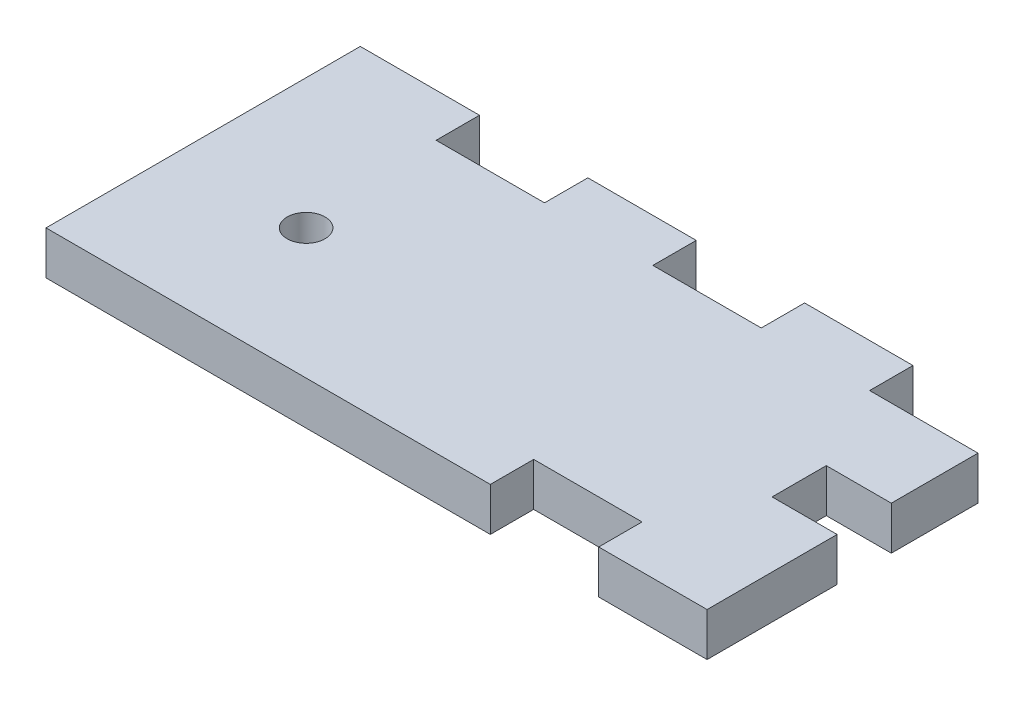
ISO-10303-21;
HEADER;
FILE_DESCRIPTION(('STEP AP214'),'2;1');
FILE_NAME('part.step','',(''),(''),'','','');
FILE_SCHEMA(('AUTOMOTIVE_DESIGN { 1 0 10303 214 1 1 1 1 }'));
ENDSEC;
DATA;
#1=APPLICATION_CONTEXT('core data for automotive mechanical design processes');
#2=APPLICATION_PROTOCOL_DEFINITION('international standard','automotive_design',2000,#1);
#3=PRODUCT_CONTEXT('',#1,'mechanical');
#4=PRODUCT('Part','Part','',(#3));
#5=PRODUCT_RELATED_PRODUCT_CATEGORY('part','',(#4));
#6=PRODUCT_DEFINITION_FORMATION('','',#4);
#7=PRODUCT_DEFINITION_CONTEXT('part definition',#1,'design');
#8=PRODUCT_DEFINITION('design','',#6,#7);
#9=PRODUCT_DEFINITION_SHAPE('','',#8);
#10=(LENGTH_UNIT() NAMED_UNIT(*) SI_UNIT(.MILLI.,.METRE.));
#11=(NAMED_UNIT(*) PLANE_ANGLE_UNIT() SI_UNIT($,.RADIAN.));
#12=(NAMED_UNIT(*) SI_UNIT($,.STERADIAN.) SOLID_ANGLE_UNIT());
#13=UNCERTAINTY_MEASURE_WITH_UNIT(LENGTH_MEASURE(1.E-05),#10,'distance_accuracy_value','');
#14=(GEOMETRIC_REPRESENTATION_CONTEXT(3) GLOBAL_UNCERTAINTY_ASSIGNED_CONTEXT((#13)) GLOBAL_UNIT_ASSIGNED_CONTEXT((#10,
#11,#12)) REPRESENTATION_CONTEXT('',''));
#15=CARTESIAN_POINT('',(0.,0.,0.));
#16=DIRECTION('',(0.,0.,1.));
#17=DIRECTION('',(1.,0.,0.));
#18=AXIS2_PLACEMENT_3D('',#15,#16,#17);
#19=CARTESIAN_POINT('',(0.,4.,21.));
#20=DIRECTION('',(0.,0.,-1.));
#21=DIRECTION('',(-1.,0.,0.));
#22=AXIS2_PLACEMENT_3D('',#19,#20,#21);
#23=PLANE('',#22);
#24=DIRECTION('',(1.,0.,0.));
#25=VECTOR('',#24,1.);
#26=CARTESIAN_POINT('',(0.,0.,21.));
#27=LINE('',#26,#25);
#28=CARTESIAN_POINT('',(41.,0.,21.));
#29=VERTEX_POINT('',#28);
#30=CARTESIAN_POINT('',(51.,0.,21.));
#31=VERTEX_POINT('',#30);
#32=EDGE_CURVE('E354',#29,#31,#27,.T.);
#33=ORIENTED_EDGE('',*,*,#32,.T.);
#34=DIRECTION('',(0.,1.,0.));
#35=VECTOR('',#34,1.);
#36=CARTESIAN_POINT('',(51.,0.,21.));
#37=LINE('',#36,#35);
#38=CARTESIAN_POINT('',(51.,4.,21.));
#39=VERTEX_POINT('',#38);
#40=EDGE_CURVE('E210',#31,#39,#37,.T.);
#41=ORIENTED_EDGE('',*,*,#40,.T.);
#42=DIRECTION('',(1.,0.,0.));
#43=VECTOR('',#42,1.);
#44=CARTESIAN_POINT('',(0.,4.,21.));
#45=LINE('',#44,#43);
#46=CARTESIAN_POINT('',(41.,4.,21.));
#47=VERTEX_POINT('',#46);
#48=EDGE_CURVE('E347',#47,#39,#45,.T.);
#49=ORIENTED_EDGE('',*,*,#48,.F.);
#50=DIRECTION('',(0.,1.,0.));
#51=VECTOR('',#50,1.);
#52=CARTESIAN_POINT('',(41.,0.,21.));
#53=LINE('',#52,#51);
#54=EDGE_CURVE('E53',#29,#47,#53,.T.);
#55=ORIENTED_EDGE('',*,*,#54,.F.);
#56=EDGE_LOOP('',(#33,#41,#49,#55));
#57=FACE_BOUND('',#56,.T.);
#58=ADVANCED_FACE('F35',(#57),#23,.F.);
#59=CARTESIAN_POINT('',(0.,4.,0.));
#60=DIRECTION('',(0.,0.,1.));
#61=DIRECTION('',(1.,0.,0.));
#62=AXIS2_PLACEMENT_3D('',#59,#60,#61);
#63=PLANE('',#62);
#64=DIRECTION('',(-1.,0.,0.));
#65=VECTOR('',#64,1.);
#66=CARTESIAN_POINT('',(0.,0.,0.));
#67=LINE('',#66,#65);
#68=CARTESIAN_POINT('',(21.,0.,0.));
#69=VERTEX_POINT('',#68);
#70=CARTESIAN_POINT('',(11.,0.,0.));
#71=VERTEX_POINT('',#70);
#72=EDGE_CURVE('E356',#69,#71,#67,.T.);
#73=ORIENTED_EDGE('',*,*,#72,.T.);
#74=DIRECTION('',(0.,1.,0.));
#75=VECTOR('',#74,1.);
#76=CARTESIAN_POINT('',(11.,0.,0.));
#77=LINE('',#76,#75);
#78=CARTESIAN_POINT('',(11.,4.,0.));
#79=VERTEX_POINT('',#78);
#80=EDGE_CURVE('E61',#71,#79,#77,.T.);
#81=ORIENTED_EDGE('',*,*,#80,.T.);
#82=DIRECTION('',(-1.,0.,0.));
#83=VECTOR('',#82,1.);
#84=CARTESIAN_POINT('',(0.,4.,0.));
#85=LINE('',#84,#83);
#86=CARTESIAN_POINT('',(21.,4.,0.));
#87=VERTEX_POINT('',#86);
#88=EDGE_CURVE('E46',#87,#79,#85,.T.);
#89=ORIENTED_EDGE('',*,*,#88,.F.);
#90=DIRECTION('',(0.,1.,0.));
#91=VECTOR('',#90,1.);
#92=CARTESIAN_POINT('',(21.,0.,0.));
#93=LINE('',#92,#91);
#94=EDGE_CURVE('E280',#69,#87,#93,.T.);
#95=ORIENTED_EDGE('',*,*,#94,.F.);
#96=EDGE_LOOP('',(#73,#81,#89,#95));
#97=FACE_BOUND('',#96,.T.);
#98=ADVANCED_FACE('F406',(#97),#63,.F.);
#99=CARTESIAN_POINT('',(41.,0.,0.));
#100=VERTEX_POINT('',#99);
#101=CARTESIAN_POINT('',(31.,0.,0.));
#102=VERTEX_POINT('',#101);
#103=EDGE_CURVE('E359',#100,#102,#67,.T.);
#104=ORIENTED_EDGE('',*,*,#103,.T.);
#105=DIRECTION('',(0.,1.,0.));
#106=VECTOR('',#105,1.);
#107=CARTESIAN_POINT('',(31.,0.,0.));
#108=LINE('',#107,#106);
#109=CARTESIAN_POINT('',(31.,4.,0.));
#110=VERTEX_POINT('',#109);
#111=EDGE_CURVE('E277',#102,#110,#108,.T.);
#112=ORIENTED_EDGE('',*,*,#111,.T.);
#113=CARTESIAN_POINT('',(41.,4.,0.));
#114=VERTEX_POINT('',#113);
#115=EDGE_CURVE('E44',#114,#110,#85,.T.);
#116=ORIENTED_EDGE('',*,*,#115,.F.);
#117=DIRECTION('',(0.,1.,0.));
#118=VECTOR('',#117,1.);
#119=CARTESIAN_POINT('',(41.,0.,0.));
#120=LINE('',#119,#118);
#121=EDGE_CURVE('E307',#100,#114,#120,.T.);
#122=ORIENTED_EDGE('',*,*,#121,.F.);
#123=EDGE_LOOP('',(#104,#112,#116,#122));
#124=FACE_BOUND('',#123,.T.);
#125=ADVANCED_FACE('F422',(#124),#63,.F.);
#126=CARTESIAN_POINT('',(55.,4.,0.));
#127=DIRECTION('',(-1.,0.,0.));
#128=DIRECTION('',(0.,0.,1.));
#129=AXIS2_PLACEMENT_3D('',#126,#127,#128);
#130=PLANE('',#129);
#131=DIRECTION('',(0.,-1.,0.));
#132=VECTOR('',#131,1.);
#133=CARTESIAN_POINT('',(55.,4.,8.));
#134=LINE('',#133,#132);
#135=CARTESIAN_POINT('',(55.,4.,8.));
#136=VERTEX_POINT('',#135);
#137=CARTESIAN_POINT('',(55.,0.,8.));
#138=VERTEX_POINT('',#137);
#139=EDGE_CURVE('E306',#136,#138,#134,.T.);
#140=ORIENTED_EDGE('',*,*,#139,.F.);
#141=DIRECTION('',(0.,0.,-1.));
#142=VECTOR('',#141,1.);
#143=CARTESIAN_POINT('',(55.,4.,0.));
#144=LINE('',#143,#142);
#145=CARTESIAN_POINT('',(55.,4.,13.));
#146=VERTEX_POINT('',#145);
#147=EDGE_CURVE('E350',#146,#136,#144,.T.);
#148=ORIENTED_EDGE('',*,*,#147,.F.);
#149=DIRECTION('',(0.,1.,0.));
#150=VECTOR('',#149,1.);
#151=CARTESIAN_POINT('',(55.,4.,13.));
#152=LINE('',#151,#150);
#153=CARTESIAN_POINT('',(55.,0.,13.));
#154=VERTEX_POINT('',#153);
#155=EDGE_CURVE('E330',#154,#146,#152,.T.);
#156=ORIENTED_EDGE('',*,*,#155,.F.);
#157=DIRECTION('',(0.,0.,-1.));
#158=VECTOR('',#157,1.);
#159=CARTESIAN_POINT('',(55.,0.,0.));
#160=LINE('',#159,#158);
#161=EDGE_CURVE('E355',#154,#138,#160,.T.);
#162=ORIENTED_EDGE('',*,*,#161,.T.);
#163=EDGE_LOOP('',(#140,#148,#156,#162));
#164=FACE_BOUND('',#163,.T.);
#165=ADVANCED_FACE('F433',(#164),#130,.F.);
#166=CARTESIAN_POINT('',(0.,4.,0.));
#167=DIRECTION('',(1.,0.,0.));
#168=DIRECTION('',(0.,0.,-1.));
#169=AXIS2_PLACEMENT_3D('',#166,#167,#168);
#170=PLANE('',#169);
#171=DIRECTION('',(0.,0.,1.));
#172=VECTOR('',#171,1.);
#173=CARTESIAN_POINT('',(0.,0.,0.));
#174=LINE('',#173,#172);
#175=CARTESIAN_POINT('',(0.,0.,-4.));
#176=VERTEX_POINT('',#175);
#177=CARTESIAN_POINT('',(0.,0.,25.));
#178=VERTEX_POINT('',#177);
#179=EDGE_CURVE('E344',#176,#178,#174,.T.);
#180=ORIENTED_EDGE('',*,*,#179,.T.);
#181=DIRECTION('',(0.,1.,0.));
#182=VECTOR('',#181,1.);
#183=CARTESIAN_POINT('',(0.,0.,25.));
#184=LINE('',#183,#182);
#185=CARTESIAN_POINT('',(0.,4.,25.));
#186=VERTEX_POINT('',#185);
#187=EDGE_CURVE('E230',#178,#186,#184,.T.);
#188=ORIENTED_EDGE('',*,*,#187,.T.);
#189=DIRECTION('',(0.,0.,1.));
#190=VECTOR('',#189,1.);
#191=CARTESIAN_POINT('',(0.,4.,0.));
#192=LINE('',#191,#190);
#193=CARTESIAN_POINT('',(0.,4.,-4.));
#194=VERTEX_POINT('',#193);
#195=EDGE_CURVE('E345',#194,#186,#192,.T.);
#196=ORIENTED_EDGE('',*,*,#195,.F.);
#197=DIRECTION('',(0.,1.,0.));
#198=VECTOR('',#197,1.);
#199=CARTESIAN_POINT('',(0.,0.,-4.));
#200=LINE('',#199,#198);
#201=EDGE_CURVE('E236',#176,#194,#200,.T.);
#202=ORIENTED_EDGE('',*,*,#201,.F.);
#203=EDGE_LOOP('',(#180,#188,#196,#202));
#204=FACE_BOUND('',#203,.T.);
#205=ADVANCED_FACE('F37',(#204),#170,.F.);
#206=CARTESIAN_POINT('',(61.,0.,0.));
#207=VERTEX_POINT('',#206);
#208=CARTESIAN_POINT('',(51.,0.,0.));
#209=VERTEX_POINT('',#208);
#210=EDGE_CURVE('E39',#207,#209,#67,.T.);
#211=ORIENTED_EDGE('',*,*,#210,.T.);
#212=DIRECTION('',(0.,1.,0.));
#213=VECTOR('',#212,1.);
#214=CARTESIAN_POINT('',(51.,0.,0.));
#215=LINE('',#214,#213);
#216=CARTESIAN_POINT('',(51.,4.,0.));
#217=VERTEX_POINT('',#216);
#218=EDGE_CURVE('E303',#209,#217,#215,.T.);
#219=ORIENTED_EDGE('',*,*,#218,.T.);
#220=CARTESIAN_POINT('',(61.,4.,0.));
#221=VERTEX_POINT('',#220);
#222=EDGE_CURVE('E11',#221,#217,#85,.T.);
#223=ORIENTED_EDGE('',*,*,#222,.F.);
#224=DIRECTION('',(0.,1.,0.));
#225=VECTOR('',#224,1.);
#226=CARTESIAN_POINT('',(61.,4.,0.));
#227=LINE('',#226,#225);
#228=EDGE_CURVE('E312',#207,#221,#227,.T.);
#229=ORIENTED_EDGE('',*,*,#228,.F.);
#230=EDGE_LOOP('',(#211,#219,#223,#229));
#231=FACE_BOUND('',#230,.T.);
#232=ADVANCED_FACE('F364',(#231),#63,.F.);
#233=CARTESIAN_POINT('',(0.,4.,0.));
#234=DIRECTION('',(0.,1.,0.));
#235=DIRECTION('',(0.,0.,1.));
#236=AXIS2_PLACEMENT_3D('',#233,#234,#235);
#237=PLANE('',#236);
#238=CARTESIAN_POINT('',(12.,4.,13.));
#239=DIRECTION('',(0.,1.,0.));
#240=DIRECTION('',(0.,0.,1.));
#241=AXIS2_PLACEMENT_3D('',#238,#239,#240);
#242=CIRCLE('',#241,1.75);
#243=CARTESIAN_POINT('',(12.,4.,14.75));
#244=VERTEX_POINT('',#243);
#245=EDGE_CURVE('E215',#244,#244,#242,.T.);
#246=ORIENTED_EDGE('',*,*,#245,.F.);
#247=EDGE_LOOP('',(#246));
#248=FACE_BOUND('',#247,.T.);
#249=DIRECTION('',(-1.,0.,0.));
#250=VECTOR('',#249,1.);
#251=CARTESIAN_POINT('',(11.,4.,-4.));
#252=LINE('',#251,#250);
#253=CARTESIAN_POINT('',(11.,4.,-4.));
#254=VERTEX_POINT('',#253);
#255=EDGE_CURVE('E248',#254,#194,#252,.T.);
#256=ORIENTED_EDGE('',*,*,#255,.T.);
#257=ORIENTED_EDGE('',*,*,#195,.T.);
#258=DIRECTION('',(1.,0.,0.));
#259=VECTOR('',#258,1.);
#260=CARTESIAN_POINT('',(0.,4.,25.));
#261=LINE('',#260,#259);
#262=CARTESIAN_POINT('',(41.,4.,25.));
#263=VERTEX_POINT('',#262);
#264=EDGE_CURVE('E221',#186,#263,#261,.T.);
#265=ORIENTED_EDGE('',*,*,#264,.T.);
#266=DIRECTION('',(0.,0.,-1.));
#267=VECTOR('',#266,1.);
#268=CARTESIAN_POINT('',(41.,4.,21.));
#269=LINE('',#268,#267);
#270=EDGE_CURVE('E227',#263,#47,#269,.T.);
#271=ORIENTED_EDGE('',*,*,#270,.T.);
#272=ORIENTED_EDGE('',*,*,#48,.T.);
#273=DIRECTION('',(0.,0.,1.));
#274=VECTOR('',#273,1.);
#275=CARTESIAN_POINT('',(51.,4.,25.));
#276=LINE('',#275,#274);
#277=CARTESIAN_POINT('',(51.,4.,25.));
#278=VERTEX_POINT('',#277);
#279=EDGE_CURVE('E212',#39,#278,#276,.T.);
#280=ORIENTED_EDGE('',*,*,#279,.T.);
#281=DIRECTION('',(1.,0.,0.));
#282=VECTOR('',#281,1.);
#283=CARTESIAN_POINT('',(51.,4.,25.));
#284=LINE('',#283,#282);
#285=CARTESIAN_POINT('',(61.,4.,25.));
#286=VERTEX_POINT('',#285);
#287=EDGE_CURVE('E194',#278,#286,#284,.T.);
#288=ORIENTED_EDGE('',*,*,#287,.T.);
#289=DIRECTION('',(0.,0.,1.));
#290=VECTOR('',#289,1.);
#291=CARTESIAN_POINT('',(61.,4.,21.));
#292=LINE('',#291,#290);
#293=CARTESIAN_POINT('',(61.,4.,13.));
#294=VERTEX_POINT('',#293);
#295=EDGE_CURVE('E334',#294,#286,#292,.T.);
#296=ORIENTED_EDGE('',*,*,#295,.F.);
#297=DIRECTION('',(-1.,0.,0.));
#298=VECTOR('',#297,1.);
#299=CARTESIAN_POINT('',(61.,4.,13.));
#300=LINE('',#299,#298);
#301=EDGE_CURVE('E336',#294,#146,#300,.T.);
#302=ORIENTED_EDGE('',*,*,#301,.T.);
#303=ORIENTED_EDGE('',*,*,#147,.T.);
#304=DIRECTION('',(-1.,0.,0.));
#305=VECTOR('',#304,1.);
#306=CARTESIAN_POINT('',(61.,4.,8.));
#307=LINE('',#306,#305);
#308=CARTESIAN_POINT('',(61.,4.,8.));
#309=VERTEX_POINT('',#308);
#310=EDGE_CURVE('E327',#309,#136,#307,.T.);
#311=ORIENTED_EDGE('',*,*,#310,.F.);
#312=DIRECTION('',(0.,0.,1.));
#313=VECTOR('',#312,1.);
#314=CARTESIAN_POINT('',(61.,4.,0.));
#315=LINE('',#314,#313);
#316=EDGE_CURVE('E315',#221,#309,#315,.T.);
#317=ORIENTED_EDGE('',*,*,#316,.F.);
#318=ORIENTED_EDGE('',*,*,#222,.T.);
#319=DIRECTION('',(0.,0.,-1.));
#320=VECTOR('',#319,1.);
#321=CARTESIAN_POINT('',(51.,4.,0.));
#322=LINE('',#321,#320);
#323=CARTESIAN_POINT('',(51.,4.,-4.));
#324=VERTEX_POINT('',#323);
#325=EDGE_CURVE('E279',#217,#324,#322,.T.);
#326=ORIENTED_EDGE('',*,*,#325,.T.);
#327=DIRECTION('',(-1.,0.,0.));
#328=VECTOR('',#327,1.);
#329=CARTESIAN_POINT('',(51.,4.,-4.));
#330=LINE('',#329,#328);
#331=CARTESIAN_POINT('',(41.,4.,-4.));
#332=VERTEX_POINT('',#331);
#333=EDGE_CURVE('E298',#324,#332,#330,.T.);
#334=ORIENTED_EDGE('',*,*,#333,.T.);
#335=DIRECTION('',(0.,0.,1.));
#336=VECTOR('',#335,1.);
#337=CARTESIAN_POINT('',(41.,4.,0.));
#338=LINE('',#337,#336);
#339=EDGE_CURVE('E290',#332,#114,#338,.T.);
#340=ORIENTED_EDGE('',*,*,#339,.T.);
#341=ORIENTED_EDGE('',*,*,#115,.T.);
#342=DIRECTION('',(0.,0.,-1.));
#343=VECTOR('',#342,1.);
#344=CARTESIAN_POINT('',(31.,4.,0.));
#345=LINE('',#344,#343);
#346=CARTESIAN_POINT('',(31.,4.,-4.));
#347=VERTEX_POINT('',#346);
#348=EDGE_CURVE('E257',#110,#347,#345,.T.);
#349=ORIENTED_EDGE('',*,*,#348,.T.);
#350=DIRECTION('',(-1.,0.,0.));
#351=VECTOR('',#350,1.);
#352=CARTESIAN_POINT('',(31.,4.,-4.));
#353=LINE('',#352,#351);
#354=CARTESIAN_POINT('',(21.,4.,-4.));
#355=VERTEX_POINT('',#354);
#356=EDGE_CURVE('E272',#347,#355,#353,.T.);
#357=ORIENTED_EDGE('',*,*,#356,.T.);
#358=DIRECTION('',(0.,0.,1.));
#359=VECTOR('',#358,1.);
#360=CARTESIAN_POINT('',(21.,4.,0.));
#361=LINE('',#360,#359);
#362=EDGE_CURVE('E263',#355,#87,#361,.T.);
#363=ORIENTED_EDGE('',*,*,#362,.T.);
#364=ORIENTED_EDGE('',*,*,#88,.T.);
#365=DIRECTION('',(0.,0.,-1.));
#366=VECTOR('',#365,1.);
#367=CARTESIAN_POINT('',(11.,4.,0.));
#368=LINE('',#367,#366);
#369=EDGE_CURVE('E243',#79,#254,#368,.T.);
#370=ORIENTED_EDGE('',*,*,#369,.T.);
#371=EDGE_LOOP('',(#256,#257,#265,#271,#272,#280,#288,#296,#302,#303,#311,#317,#318,#326,#334,
#340,#341,#349,#357,#363,#364,#370));
#372=FACE_BOUND('',#371,.T.);
#373=ADVANCED_FACE('F384',(#248,#372),#237,.T.);
#374=CARTESIAN_POINT('',(0.,0.,0.));
#375=DIRECTION('',(0.,1.,0.));
#376=DIRECTION('',(0.,0.,1.));
#377=AXIS2_PLACEMENT_3D('',#374,#375,#376);
#378=PLANE('',#377);
#379=CARTESIAN_POINT('',(12.,0.,13.));
#380=DIRECTION('',(0.,1.,0.));
#381=DIRECTION('',(0.,0.,1.));
#382=AXIS2_PLACEMENT_3D('',#379,#380,#381);
#383=CIRCLE('',#382,1.75);
#384=CARTESIAN_POINT('',(12.,0.,14.75));
#385=VERTEX_POINT('',#384);
#386=EDGE_CURVE('E218',#385,#385,#383,.T.);
#387=ORIENTED_EDGE('',*,*,#386,.T.);
#388=EDGE_LOOP('',(#387));
#389=FACE_BOUND('',#388,.T.);
#390=ORIENTED_EDGE('',*,*,#179,.F.);
#391=DIRECTION('',(-1.,0.,0.));
#392=VECTOR('',#391,1.);
#393=CARTESIAN_POINT('',(11.,0.,-4.));
#394=LINE('',#393,#392);
#395=CARTESIAN_POINT('',(11.,0.,-4.));
#396=VERTEX_POINT('',#395);
#397=EDGE_CURVE('E247',#396,#176,#394,.T.);
#398=ORIENTED_EDGE('',*,*,#397,.F.);
#399=DIRECTION('',(0.,0.,-1.));
#400=VECTOR('',#399,1.);
#401=CARTESIAN_POINT('',(11.,0.,0.));
#402=LINE('',#401,#400);
#403=EDGE_CURVE('E244',#71,#396,#402,.T.);
#404=ORIENTED_EDGE('',*,*,#403,.F.);
#405=ORIENTED_EDGE('',*,*,#72,.F.);
#406=DIRECTION('',(0.,0.,1.));
#407=VECTOR('',#406,1.);
#408=CARTESIAN_POINT('',(21.,0.,0.));
#409=LINE('',#408,#407);
#410=CARTESIAN_POINT('',(21.,0.,-4.));
#411=VERTEX_POINT('',#410);
#412=EDGE_CURVE('E266',#411,#69,#409,.T.);
#413=ORIENTED_EDGE('',*,*,#412,.F.);
#414=DIRECTION('',(-1.,0.,0.));
#415=VECTOR('',#414,1.);
#416=CARTESIAN_POINT('',(31.,0.,-4.));
#417=LINE('',#416,#415);
#418=CARTESIAN_POINT('',(31.,0.,-4.));
#419=VERTEX_POINT('',#418);
#420=EDGE_CURVE('E262',#419,#411,#417,.T.);
#421=ORIENTED_EDGE('',*,*,#420,.F.);
#422=DIRECTION('',(0.,0.,-1.));
#423=VECTOR('',#422,1.);
#424=CARTESIAN_POINT('',(31.,0.,0.));
#425=LINE('',#424,#423);
#426=EDGE_CURVE('E259',#102,#419,#425,.T.);
#427=ORIENTED_EDGE('',*,*,#426,.F.);
#428=ORIENTED_EDGE('',*,*,#103,.F.);
#429=DIRECTION('',(0.,0.,1.));
#430=VECTOR('',#429,1.);
#431=CARTESIAN_POINT('',(41.,0.,0.));
#432=LINE('',#431,#430);
#433=CARTESIAN_POINT('',(41.,0.,-4.));
#434=VERTEX_POINT('',#433);
#435=EDGE_CURVE('E293',#434,#100,#432,.T.);
#436=ORIENTED_EDGE('',*,*,#435,.F.);
#437=DIRECTION('',(-1.,0.,0.));
#438=VECTOR('',#437,1.);
#439=CARTESIAN_POINT('',(51.,0.,-4.));
#440=LINE('',#439,#438);
#441=CARTESIAN_POINT('',(51.,0.,-4.));
#442=VERTEX_POINT('',#441);
#443=EDGE_CURVE('E289',#442,#434,#440,.T.);
#444=ORIENTED_EDGE('',*,*,#443,.F.);
#445=DIRECTION('',(0.,0.,-1.));
#446=VECTOR('',#445,1.);
#447=CARTESIAN_POINT('',(51.,0.,0.));
#448=LINE('',#447,#446);
#449=EDGE_CURVE('E286',#209,#442,#448,.T.);
#450=ORIENTED_EDGE('',*,*,#449,.F.);
#451=ORIENTED_EDGE('',*,*,#210,.F.);
#452=DIRECTION('',(0.,0.,-1.));
#453=VECTOR('',#452,1.);
#454=CARTESIAN_POINT('',(61.,0.,0.));
#455=LINE('',#454,#453);
#456=CARTESIAN_POINT('',(61.,0.,8.));
#457=VERTEX_POINT('',#456);
#458=EDGE_CURVE('E319',#457,#207,#455,.T.);
#459=ORIENTED_EDGE('',*,*,#458,.F.);
#460=DIRECTION('',(-1.,0.,0.));
#461=VECTOR('',#460,1.);
#462=CARTESIAN_POINT('',(61.,0.,8.));
#463=LINE('',#462,#461);
#464=EDGE_CURVE('E322',#457,#138,#463,.T.);
#465=ORIENTED_EDGE('',*,*,#464,.T.);
#466=ORIENTED_EDGE('',*,*,#161,.F.);
#467=DIRECTION('',(-1.,0.,0.));
#468=VECTOR('',#467,1.);
#469=CARTESIAN_POINT('',(61.,0.,13.));
#470=LINE('',#469,#468);
#471=CARTESIAN_POINT('',(61.,0.,13.));
#472=VERTEX_POINT('',#471);
#473=EDGE_CURVE('E341',#472,#154,#470,.T.);
#474=ORIENTED_EDGE('',*,*,#473,.F.);
#475=DIRECTION('',(0.,0.,-1.));
#476=VECTOR('',#475,1.);
#477=CARTESIAN_POINT('',(61.,0.,21.));
#478=LINE('',#477,#476);
#479=CARTESIAN_POINT('',(61.,0.,25.));
#480=VERTEX_POINT('',#479);
#481=EDGE_CURVE('E205',#480,#472,#478,.T.);
#482=ORIENTED_EDGE('',*,*,#481,.F.);
#483=DIRECTION('',(1.,0.,0.));
#484=VECTOR('',#483,1.);
#485=CARTESIAN_POINT('',(51.,0.,25.));
#486=LINE('',#485,#484);
#487=CARTESIAN_POINT('',(51.,0.,25.));
#488=VERTEX_POINT('',#487);
#489=EDGE_CURVE('E192',#488,#480,#486,.T.);
#490=ORIENTED_EDGE('',*,*,#489,.F.);
#491=DIRECTION('',(0.,0.,1.));
#492=VECTOR('',#491,1.);
#493=CARTESIAN_POINT('',(51.,0.,25.));
#494=LINE('',#493,#492);
#495=EDGE_CURVE('E203',#31,#488,#494,.T.);
#496=ORIENTED_EDGE('',*,*,#495,.F.);
#497=ORIENTED_EDGE('',*,*,#32,.F.);
#498=DIRECTION('',(0.,0.,-1.));
#499=VECTOR('',#498,1.);
#500=CARTESIAN_POINT('',(41.,0.,21.));
#501=LINE('',#500,#499);
#502=CARTESIAN_POINT('',(41.,0.,25.));
#503=VERTEX_POINT('',#502);
#504=EDGE_CURVE('E226',#503,#29,#501,.T.);
#505=ORIENTED_EDGE('',*,*,#504,.F.);
#506=DIRECTION('',(1.,0.,0.));
#507=VECTOR('',#506,1.);
#508=CARTESIAN_POINT('',(0.,0.,25.));
#509=LINE('',#508,#507);
#510=EDGE_CURVE('E223',#178,#503,#509,.T.);
#511=ORIENTED_EDGE('',*,*,#510,.F.);
#512=EDGE_LOOP('',(#390,#398,#404,#405,#413,#421,#427,#428,#436,#444,#450,#451,#459,#465,#466,
#474,#482,#490,#496,#497,#505,#511));
#513=FACE_BOUND('',#512,.T.);
#514=ADVANCED_FACE('F202',(#389,#513),#378,.F.);
#515=CARTESIAN_POINT('',(61.,4.,13.));
#516=DIRECTION('',(0.,0.,1.));
#517=DIRECTION('',(1.,0.,0.));
#518=AXIS2_PLACEMENT_3D('',#515,#516,#517);
#519=PLANE('',#518);
#520=ORIENTED_EDGE('',*,*,#155,.T.);
#521=ORIENTED_EDGE('',*,*,#301,.F.);
#522=DIRECTION('',(0.,1.,0.));
#523=VECTOR('',#522,1.);
#524=CARTESIAN_POINT('',(61.,4.,13.));
#525=LINE('',#524,#523);
#526=EDGE_CURVE('E332',#472,#294,#525,.T.);
#527=ORIENTED_EDGE('',*,*,#526,.F.);
#528=ORIENTED_EDGE('',*,*,#473,.T.);
#529=EDGE_LOOP('',(#520,#521,#527,#528));
#530=FACE_BOUND('',#529,.T.);
#531=ADVANCED_FACE('F378',(#530),#519,.F.);
#532=CARTESIAN_POINT('',(61.,0.,0.));
#533=DIRECTION('',(1.,0.,0.));
#534=DIRECTION('',(0.,0.,-1.));
#535=AXIS2_PLACEMENT_3D('',#532,#533,#534);
#536=PLANE('',#535);
#537=ORIENTED_EDGE('',*,*,#295,.T.);
#538=DIRECTION('',(0.,1.,0.));
#539=VECTOR('',#538,1.);
#540=CARTESIAN_POINT('',(61.,0.,25.));
#541=LINE('',#540,#539);
#542=EDGE_CURVE('E198',#480,#286,#541,.T.);
#543=ORIENTED_EDGE('',*,*,#542,.F.);
#544=ORIENTED_EDGE('',*,*,#481,.T.);
#545=ORIENTED_EDGE('',*,*,#526,.T.);
#546=EDGE_LOOP('',(#537,#543,#544,#545));
#547=FACE_BOUND('',#546,.T.);
#548=ADVANCED_FACE('F382',(#547),#536,.T.);
#549=CARTESIAN_POINT('',(61.,4.,8.));
#550=DIRECTION('',(0.,0.,-1.));
#551=DIRECTION('',(-1.,0.,0.));
#552=AXIS2_PLACEMENT_3D('',#549,#550,#551);
#553=PLANE('',#552);
#554=ORIENTED_EDGE('',*,*,#139,.T.);
#555=ORIENTED_EDGE('',*,*,#464,.F.);
#556=DIRECTION('',(0.,-1.,0.));
#557=VECTOR('',#556,1.);
#558=CARTESIAN_POINT('',(61.,4.,8.));
#559=LINE('',#558,#557);
#560=EDGE_CURVE('E317',#309,#457,#559,.T.);
#561=ORIENTED_EDGE('',*,*,#560,.F.);
#562=ORIENTED_EDGE('',*,*,#310,.T.);
#563=EDGE_LOOP('',(#554,#555,#561,#562));
#564=FACE_BOUND('',#563,.T.);
#565=ADVANCED_FACE('F375',(#564),#553,.F.);
#566=CARTESIAN_POINT('',(61.,0.,0.));
#567=DIRECTION('',(-1.,0.,0.));
#568=DIRECTION('',(0.,0.,1.));
#569=AXIS2_PLACEMENT_3D('',#566,#567,#568);
#570=PLANE('',#569);
#571=ORIENTED_EDGE('',*,*,#228,.T.);
#572=ORIENTED_EDGE('',*,*,#316,.T.);
#573=ORIENTED_EDGE('',*,*,#560,.T.);
#574=ORIENTED_EDGE('',*,*,#458,.T.);
#575=EDGE_LOOP('',(#571,#572,#573,#574));
#576=FACE_BOUND('',#575,.T.);
#577=ADVANCED_FACE('F369',(#576),#570,.F.);
#578=CARTESIAN_POINT('',(51.,0.,0.));
#579=DIRECTION('',(1.,0.,0.));
#580=DIRECTION('',(0.,0.,-1.));
#581=AXIS2_PLACEMENT_3D('',#578,#579,#580);
#582=PLANE('',#581);
#583=ORIENTED_EDGE('',*,*,#325,.F.);
#584=ORIENTED_EDGE('',*,*,#218,.F.);
#585=ORIENTED_EDGE('',*,*,#449,.T.);
#586=DIRECTION('',(0.,1.,0.));
#587=VECTOR('',#586,1.);
#588=CARTESIAN_POINT('',(51.,0.,-4.));
#589=LINE('',#588,#587);
#590=EDGE_CURVE('E295',#442,#324,#589,.T.);
#591=ORIENTED_EDGE('',*,*,#590,.T.);
#592=EDGE_LOOP('',(#583,#584,#585,#591));
#593=FACE_BOUND('',#592,.T.);
#594=ADVANCED_FACE('F432',(#593),#582,.T.);
#595=CARTESIAN_POINT('',(41.,0.,0.));
#596=DIRECTION('',(-1.,0.,0.));
#597=DIRECTION('',(0.,0.,1.));
#598=AXIS2_PLACEMENT_3D('',#595,#596,#597);
#599=PLANE('',#598);
#600=ORIENTED_EDGE('',*,*,#339,.F.);
#601=DIRECTION('',(0.,1.,0.));
#602=VECTOR('',#601,1.);
#603=CARTESIAN_POINT('',(41.,0.,-4.));
#604=LINE('',#603,#602);
#605=EDGE_CURVE('E309',#434,#332,#604,.T.);
#606=ORIENTED_EDGE('',*,*,#605,.F.);
#607=ORIENTED_EDGE('',*,*,#435,.T.);
#608=ORIENTED_EDGE('',*,*,#121,.T.);
#609=EDGE_LOOP('',(#600,#606,#607,#608));
#610=FACE_BOUND('',#609,.T.);
#611=ADVANCED_FACE('F427',(#610),#599,.T.);
#612=CARTESIAN_POINT('',(51.,0.,-4.));
#613=DIRECTION('',(0.,0.,-1.));
#614=DIRECTION('',(-1.,0.,0.));
#615=AXIS2_PLACEMENT_3D('',#612,#613,#614);
#616=PLANE('',#615);
#617=ORIENTED_EDGE('',*,*,#333,.F.);
#618=ORIENTED_EDGE('',*,*,#590,.F.);
#619=ORIENTED_EDGE('',*,*,#443,.T.);
#620=ORIENTED_EDGE('',*,*,#605,.T.);
#621=EDGE_LOOP('',(#617,#618,#619,#620));
#622=FACE_BOUND('',#621,.T.);
#623=ADVANCED_FACE('F430',(#622),#616,.T.);
#624=CARTESIAN_POINT('',(31.,0.,0.));
#625=DIRECTION('',(1.,0.,0.));
#626=DIRECTION('',(0.,0.,-1.));
#627=AXIS2_PLACEMENT_3D('',#624,#625,#626);
#628=PLANE('',#627);
#629=ORIENTED_EDGE('',*,*,#348,.F.);
#630=ORIENTED_EDGE('',*,*,#111,.F.);
#631=ORIENTED_EDGE('',*,*,#426,.T.);
#632=DIRECTION('',(0.,1.,0.));
#633=VECTOR('',#632,1.);
#634=CARTESIAN_POINT('',(31.,0.,-4.));
#635=LINE('',#634,#633);
#636=EDGE_CURVE('E269',#419,#347,#635,.T.);
#637=ORIENTED_EDGE('',*,*,#636,.T.);
#638=EDGE_LOOP('',(#629,#630,#631,#637));
#639=FACE_BOUND('',#638,.T.);
#640=ADVANCED_FACE('F418',(#639),#628,.T.);
#641=CARTESIAN_POINT('',(21.,0.,0.));
#642=DIRECTION('',(-1.,0.,0.));
#643=DIRECTION('',(0.,0.,1.));
#644=AXIS2_PLACEMENT_3D('',#641,#642,#643);
#645=PLANE('',#644);
#646=ORIENTED_EDGE('',*,*,#362,.F.);
#647=DIRECTION('',(0.,1.,0.));
#648=VECTOR('',#647,1.);
#649=CARTESIAN_POINT('',(21.,0.,-4.));
#650=LINE('',#649,#648);
#651=EDGE_CURVE('E283',#411,#355,#650,.T.);
#652=ORIENTED_EDGE('',*,*,#651,.F.);
#653=ORIENTED_EDGE('',*,*,#412,.T.);
#654=ORIENTED_EDGE('',*,*,#94,.T.);
#655=EDGE_LOOP('',(#646,#652,#653,#654));
#656=FACE_BOUND('',#655,.T.);
#657=ADVANCED_FACE('F409',(#656),#645,.T.);
#658=CARTESIAN_POINT('',(31.,0.,-4.));
#659=DIRECTION('',(0.,0.,-1.));
#660=DIRECTION('',(-1.,0.,0.));
#661=AXIS2_PLACEMENT_3D('',#658,#659,#660);
#662=PLANE('',#661);
#663=ORIENTED_EDGE('',*,*,#356,.F.);
#664=ORIENTED_EDGE('',*,*,#636,.F.);
#665=ORIENTED_EDGE('',*,*,#420,.T.);
#666=ORIENTED_EDGE('',*,*,#651,.T.);
#667=EDGE_LOOP('',(#663,#664,#665,#666));
#668=FACE_BOUND('',#667,.T.);
#669=ADVANCED_FACE('F412',(#668),#662,.T.);
#670=CARTESIAN_POINT('',(11.,0.,0.));
#671=DIRECTION('',(1.,0.,0.));
#672=DIRECTION('',(0.,0.,-1.));
#673=AXIS2_PLACEMENT_3D('',#670,#671,#672);
#674=PLANE('',#673);
#675=ORIENTED_EDGE('',*,*,#369,.F.);
#676=ORIENTED_EDGE('',*,*,#80,.F.);
#677=ORIENTED_EDGE('',*,*,#403,.T.);
#678=DIRECTION('',(0.,1.,0.));
#679=VECTOR('',#678,1.);
#680=CARTESIAN_POINT('',(11.,0.,-4.));
#681=LINE('',#680,#679);
#682=EDGE_CURVE('E251',#396,#254,#681,.T.);
#683=ORIENTED_EDGE('',*,*,#682,.T.);
#684=EDGE_LOOP('',(#675,#676,#677,#683));
#685=FACE_BOUND('',#684,.T.);
#686=ADVANCED_FACE('F403',(#685),#674,.T.);
#687=CARTESIAN_POINT('',(11.,0.,-4.));
#688=DIRECTION('',(0.,0.,-1.));
#689=DIRECTION('',(-1.,0.,0.));
#690=AXIS2_PLACEMENT_3D('',#687,#688,#689);
#691=PLANE('',#690);
#692=ORIENTED_EDGE('',*,*,#255,.F.);
#693=ORIENTED_EDGE('',*,*,#682,.F.);
#694=ORIENTED_EDGE('',*,*,#397,.T.);
#695=ORIENTED_EDGE('',*,*,#201,.T.);
#696=EDGE_LOOP('',(#692,#693,#694,#695));
#697=FACE_BOUND('',#696,.T.);
#698=ADVANCED_FACE('F400',(#697),#691,.T.);
#699=CARTESIAN_POINT('',(41.,0.,21.));
#700=DIRECTION('',(1.,0.,0.));
#701=DIRECTION('',(0.,0.,-1.));
#702=AXIS2_PLACEMENT_3D('',#699,#700,#701);
#703=PLANE('',#702);
#704=ORIENTED_EDGE('',*,*,#270,.F.);
#705=DIRECTION('',(0.,1.,0.));
#706=VECTOR('',#705,1.);
#707=CARTESIAN_POINT('',(41.,0.,25.));
#708=LINE('',#707,#706);
#709=EDGE_CURVE('E237',#503,#263,#708,.T.);
#710=ORIENTED_EDGE('',*,*,#709,.F.);
#711=ORIENTED_EDGE('',*,*,#504,.T.);
#712=ORIENTED_EDGE('',*,*,#54,.T.);
#713=EDGE_LOOP('',(#704,#710,#711,#712));
#714=FACE_BOUND('',#713,.T.);
#715=ADVANCED_FACE('F389',(#714),#703,.T.);
#716=CARTESIAN_POINT('',(0.,0.,25.));
#717=DIRECTION('',(0.,0.,1.));
#718=DIRECTION('',(1.,0.,0.));
#719=AXIS2_PLACEMENT_3D('',#716,#717,#718);
#720=PLANE('',#719);
#721=ORIENTED_EDGE('',*,*,#264,.F.);
#722=ORIENTED_EDGE('',*,*,#187,.F.);
#723=ORIENTED_EDGE('',*,*,#510,.T.);
#724=ORIENTED_EDGE('',*,*,#709,.T.);
#725=EDGE_LOOP('',(#721,#722,#723,#724));
#726=FACE_BOUND('',#725,.T.);
#727=ADVANCED_FACE('F392',(#726),#720,.T.);
#728=CARTESIAN_POINT('',(51.,0.,25.));
#729=DIRECTION('',(-1.,0.,0.));
#730=DIRECTION('',(0.,0.,1.));
#731=AXIS2_PLACEMENT_3D('',#728,#729,#730);
#732=PLANE('',#731);
#733=ORIENTED_EDGE('',*,*,#279,.F.);
#734=ORIENTED_EDGE('',*,*,#40,.F.);
#735=ORIENTED_EDGE('',*,*,#495,.T.);
#736=DIRECTION('',(0.,1.,0.));
#737=VECTOR('',#736,1.);
#738=CARTESIAN_POINT('',(51.,0.,25.));
#739=LINE('',#738,#737);
#740=EDGE_CURVE('E188',#488,#278,#739,.T.);
#741=ORIENTED_EDGE('',*,*,#740,.T.);
#742=EDGE_LOOP('',(#733,#734,#735,#741));
#743=FACE_BOUND('',#742,.T.);
#744=ADVANCED_FACE('F208',(#743),#732,.T.);
#745=CARTESIAN_POINT('',(51.,0.,25.));
#746=DIRECTION('',(0.,0.,1.));
#747=DIRECTION('',(1.,0.,0.));
#748=AXIS2_PLACEMENT_3D('',#745,#746,#747);
#749=PLANE('',#748);
#750=ORIENTED_EDGE('',*,*,#287,.F.);
#751=ORIENTED_EDGE('',*,*,#740,.F.);
#752=ORIENTED_EDGE('',*,*,#489,.T.);
#753=ORIENTED_EDGE('',*,*,#542,.T.);
#754=EDGE_LOOP('',(#750,#751,#752,#753));
#755=FACE_BOUND('',#754,.T.);
#756=ADVANCED_FACE('F190',(#755),#749,.T.);
#757=CARTESIAN_POINT('',(12.,0.,13.));
#758=DIRECTION('',(0.,1.,0.));
#759=DIRECTION('',(0.,0.,1.));
#760=AXIS2_PLACEMENT_3D('',#757,#758,#759);
#761=CYLINDRICAL_SURFACE('',#760,1.75);
#762=ORIENTED_EDGE('',*,*,#386,.F.);
#763=EDGE_LOOP('',(#762));
#764=FACE_BOUND('',#763,.T.);
#765=ORIENTED_EDGE('',*,*,#245,.T.);
#766=EDGE_LOOP('',(#765));
#767=FACE_BOUND('',#766,.T.);
#768=ADVANCED_FACE('F492',(#764,#767),#761,.F.);
#769=CLOSED_SHELL('',(#58,#98,#125,#165,#205,#232,#373,#514,#531,#548,#565,#577,#594,#611,#623,
#640,#657,#669,#686,#698,#715,#727,#744,#756,#768));
#770=MANIFOLD_SOLID_BREP('B2',#769);
#771=ADVANCED_BREP_SHAPE_REPRESENTATION('',(#18,#770),#14);
#772=SHAPE_DEFINITION_REPRESENTATION(#9,#771);
ENDSEC;
END-ISO-10303-21;
